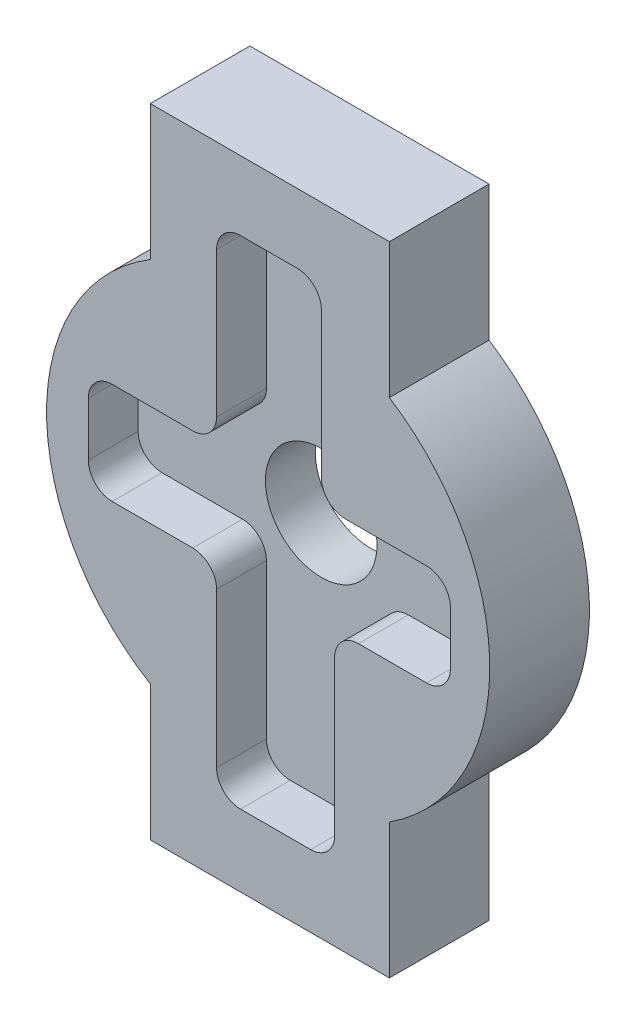
ISO-10303-21;
HEADER;
FILE_DESCRIPTION(('STEP AP214'),'2;1');
FILE_NAME('part.step','',(''),(''),'','','');
FILE_SCHEMA(('AUTOMOTIVE_DESIGN { 1 0 10303 214 1 1 1 1 }'));
ENDSEC;
DATA;
#1=APPLICATION_CONTEXT('core data for automotive mechanical design processes');
#2=APPLICATION_PROTOCOL_DEFINITION('international standard','automotive_design',2000,#1);
#3=PRODUCT_CONTEXT('',#1,'mechanical');
#4=PRODUCT('Part','Part','',(#3));
#5=PRODUCT_RELATED_PRODUCT_CATEGORY('part','',(#4));
#6=PRODUCT_DEFINITION_FORMATION('','',#4);
#7=PRODUCT_DEFINITION_CONTEXT('part definition',#1,'design');
#8=PRODUCT_DEFINITION('design','',#6,#7);
#9=PRODUCT_DEFINITION_SHAPE('','',#8);
#10=(LENGTH_UNIT() NAMED_UNIT(*) SI_UNIT(.MILLI.,.METRE.));
#11=(NAMED_UNIT(*) PLANE_ANGLE_UNIT() SI_UNIT($,.RADIAN.));
#12=(NAMED_UNIT(*) SI_UNIT($,.STERADIAN.) SOLID_ANGLE_UNIT());
#13=UNCERTAINTY_MEASURE_WITH_UNIT(LENGTH_MEASURE(1.E-05),#10,'distance_accuracy_value','');
#14=(GEOMETRIC_REPRESENTATION_CONTEXT(3) GLOBAL_UNCERTAINTY_ASSIGNED_CONTEXT((#13)) GLOBAL_UNIT_ASSIGNED_CONTEXT((#10,
#11,#12)) REPRESENTATION_CONTEXT('',''));
#15=CARTESIAN_POINT('',(0.,0.,0.));
#16=DIRECTION('',(0.,0.,1.));
#17=DIRECTION('',(1.,0.,0.));
#18=AXIS2_PLACEMENT_3D('',#15,#16,#17);
#19=CARTESIAN_POINT('',(-247.431655244566,224.,15.));
#20=DIRECTION('',(0.,0.,1.));
#21=DIRECTION('',(1.,0.,0.));
#22=AXIS2_PLACEMENT_3D('',#19,#20,#21);
#23=PLANE('',#22);
#24=DIRECTION('',(0.,-1.,0.));
#25=VECTOR('',#24,1.);
#26=CARTESIAN_POINT('',(-249.671710999745,211.604094919076,15.));
#27=LINE('',#26,#25);
#28=CARTESIAN_POINT('',(-249.671710999745,220.552559627215,15.));
#29=VERTEX_POINT('',#28);
#30=CARTESIAN_POINT('',(-249.671710999745,212.804094919076,15.));
#31=VERTEX_POINT('',#30);
#32=EDGE_CURVE('E523',#29,#31,#27,.T.);
#33=ORIENTED_EDGE('',*,*,#32,.F.);
#34=CARTESIAN_POINT('',(-250.871710999745,220.552559627215,15.));
#35=DIRECTION('',(0.,0.,1.));
#36=DIRECTION('',(1.,0.,0.));
#37=AXIS2_PLACEMENT_3D('',#34,#35,#36);
#38=CIRCLE('',#37,1.2);
#39=CARTESIAN_POINT('',(-250.871710999745,221.752559627215,15.));
#40=VERTEX_POINT('',#39);
#41=EDGE_CURVE('E349',#29,#40,#38,.T.);
#42=ORIENTED_EDGE('',*,*,#41,.T.);
#43=DIRECTION('',(1.,0.,0.));
#44=VECTOR('',#43,1.);
#45=CARTESIAN_POINT('',(-249.671710999745,221.752559627215,15.));
#46=LINE('',#45,#44);
#47=CARTESIAN_POINT('',(-254.908895334077,221.752559627215,15.));
#48=VERTEX_POINT('',#47);
#49=EDGE_CURVE('E519',#48,#40,#46,.T.);
#50=ORIENTED_EDGE('',*,*,#49,.F.);
#51=CARTESIAN_POINT('',(-254.908895334077,222.952559627215,15.));
#52=DIRECTION('',(0.,0.,1.));
#53=DIRECTION('',(1.,0.,0.));
#54=AXIS2_PLACEMENT_3D('',#51,#52,#53);
#55=CIRCLE('',#54,1.2);
#56=CARTESIAN_POINT('',(-256.108895334077,222.952559627215,15.));
#57=VERTEX_POINT('',#56);
#58=EDGE_CURVE('E410',#48,#57,#55,.F.);
#59=ORIENTED_EDGE('',*,*,#58,.T.);
#60=DIRECTION('',(0.,-1.,0.));
#61=VECTOR('',#60,1.);
#62=CARTESIAN_POINT('',(-256.108895334077,221.752559627215,15.));
#63=LINE('',#62,#61);
#64=CARTESIAN_POINT('',(-256.108895334077,225.643297037313,15.));
#65=VERTEX_POINT('',#64);
#66=EDGE_CURVE('E515',#65,#57,#63,.T.);
#67=ORIENTED_EDGE('',*,*,#66,.F.);
#68=CARTESIAN_POINT('',(-254.908895334077,225.643297037313,15.));
#69=DIRECTION('',(0.,0.,1.));
#70=DIRECTION('',(1.,0.,0.));
#71=AXIS2_PLACEMENT_3D('',#68,#69,#70);
#72=CIRCLE('',#71,1.2);
#73=CARTESIAN_POINT('',(-254.908895334077,226.843297037313,15.));
#74=VERTEX_POINT('',#73);
#75=EDGE_CURVE('E407',#65,#74,#72,.F.);
#76=ORIENTED_EDGE('',*,*,#75,.T.);
#77=DIRECTION('',(-1.,0.,0.));
#78=VECTOR('',#77,1.);
#79=CARTESIAN_POINT('',(-256.108895334077,226.843297037313,15.));
#80=LINE('',#79,#78);
#81=CARTESIAN_POINT('',(-250.871710999745,226.843297037313,15.));
#82=VERTEX_POINT('',#81);
#83=EDGE_CURVE('E511',#82,#74,#80,.T.);
#84=ORIENTED_EDGE('',*,*,#83,.F.);
#85=CARTESIAN_POINT('',(-250.871710999745,228.043297037313,15.));
#86=DIRECTION('',(0.,0.,1.));
#87=DIRECTION('',(1.,0.,0.));
#88=AXIS2_PLACEMENT_3D('',#85,#86,#87);
#89=CIRCLE('',#88,1.2);
#90=CARTESIAN_POINT('',(-249.671710999745,228.043297037313,15.));
#91=VERTEX_POINT('',#90);
#92=EDGE_CURVE('E340',#82,#91,#89,.T.);
#93=ORIENTED_EDGE('',*,*,#92,.T.);
#94=DIRECTION('',(0.,-1.,0.));
#95=VECTOR('',#94,1.);
#96=CARTESIAN_POINT('',(-249.671710999745,226.843297037313,15.));
#97=LINE('',#96,#95);
#98=CARTESIAN_POINT('',(-249.671710999745,235.326764936957,15.));
#99=VERTEX_POINT('',#98);
#100=EDGE_CURVE('E441',#99,#91,#97,.T.);
#101=ORIENTED_EDGE('',*,*,#100,.F.);
#102=CARTESIAN_POINT('',(-248.471710999745,235.326764936957,15.));
#103=DIRECTION('',(0.,0.,1.));
#104=DIRECTION('',(1.,0.,0.));
#105=AXIS2_PLACEMENT_3D('',#102,#103,#104);
#106=CIRCLE('',#105,1.2);
#107=CARTESIAN_POINT('',(-248.471710999745,236.526764936957,15.));
#108=VERTEX_POINT('',#107);
#109=EDGE_CURVE('E47',#99,#108,#106,.F.);
#110=ORIENTED_EDGE('',*,*,#109,.T.);
#111=DIRECTION('',(-1.,0.,0.));
#112=VECTOR('',#111,1.);
#113=CARTESIAN_POINT('',(-249.671710999745,236.526764936957,15.));
#114=LINE('',#113,#112);
#115=CARTESIAN_POINT('',(-245.614971282796,236.526764936957,15.));
#116=VERTEX_POINT('',#115);
#117=EDGE_CURVE('E439',#116,#108,#114,.T.);
#118=ORIENTED_EDGE('',*,*,#117,.F.);
#119=CARTESIAN_POINT('',(-245.614971282796,235.326764936957,15.));
#120=DIRECTION('',(0.,0.,1.));
#121=DIRECTION('',(1.,0.,0.));
#122=AXIS2_PLACEMENT_3D('',#119,#120,#121);
#123=CIRCLE('',#122,1.2);
#124=CARTESIAN_POINT('',(-244.414971282796,235.326764936957,15.));
#125=VERTEX_POINT('',#124);
#126=EDGE_CURVE('E11',#116,#125,#123,.F.);
#127=ORIENTED_EDGE('',*,*,#126,.T.);
#128=DIRECTION('',(0.,1.,0.));
#129=VECTOR('',#128,1.);
#130=CARTESIAN_POINT('',(-244.414971282796,236.526764936957,15.));
#131=LINE('',#130,#129);
#132=CARTESIAN_POINT('',(-244.414971282796,228.043297037313,15.));
#133=VERTEX_POINT('',#132);
#134=EDGE_CURVE('E452',#133,#125,#131,.T.);
#135=ORIENTED_EDGE('',*,*,#134,.F.);
#136=CARTESIAN_POINT('',(-243.214971282796,228.043297037313,15.));
#137=DIRECTION('',(0.,0.,1.));
#138=DIRECTION('',(1.,0.,0.));
#139=AXIS2_PLACEMENT_3D('',#136,#137,#138);
#140=CIRCLE('',#139,1.2);
#141=CARTESIAN_POINT('',(-243.214971282796,226.843297037313,15.));
#142=VERTEX_POINT('',#141);
#143=EDGE_CURVE('E343',#133,#142,#140,.T.);
#144=ORIENTED_EDGE('',*,*,#143,.T.);
#145=DIRECTION('',(-1.,0.,0.));
#146=VECTOR('',#145,1.);
#147=CARTESIAN_POINT('',(-244.414971282796,226.843297037313,15.));
#148=LINE('',#147,#146);
#149=CARTESIAN_POINT('',(-239.140881315605,226.843297037313,15.));
#150=VERTEX_POINT('',#149);
#151=EDGE_CURVE('E542',#150,#142,#148,.T.);
#152=ORIENTED_EDGE('',*,*,#151,.F.);
#153=CARTESIAN_POINT('',(-239.140881315605,225.643297037313,15.));
#154=DIRECTION('',(0.,0.,1.));
#155=DIRECTION('',(1.,0.,0.));
#156=AXIS2_PLACEMENT_3D('',#153,#154,#155);
#157=CIRCLE('',#156,1.2);
#158=CARTESIAN_POINT('',(-237.940881315605,225.643297037313,15.));
#159=VERTEX_POINT('',#158);
#160=EDGE_CURVE('E426',#150,#159,#157,.F.);
#161=ORIENTED_EDGE('',*,*,#160,.T.);
#162=DIRECTION('',(0.,1.,0.));
#163=VECTOR('',#162,1.);
#164=CARTESIAN_POINT('',(-237.940881315605,226.843297037313,15.));
#165=LINE('',#164,#163);
#166=CARTESIAN_POINT('',(-237.940881315605,222.952559627215,15.));
#167=VERTEX_POINT('',#166);
#168=EDGE_CURVE('E538',#167,#159,#165,.T.);
#169=ORIENTED_EDGE('',*,*,#168,.F.);
#170=CARTESIAN_POINT('',(-239.140881315605,222.952559627215,15.));
#171=DIRECTION('',(0.,0.,1.));
#172=DIRECTION('',(1.,0.,0.));
#173=AXIS2_PLACEMENT_3D('',#170,#171,#172);
#174=CIRCLE('',#173,1.2);
#175=CARTESIAN_POINT('',(-239.140881315605,221.752559627215,15.));
#176=VERTEX_POINT('',#175);
#177=EDGE_CURVE('E423',#167,#176,#174,.F.);
#178=ORIENTED_EDGE('',*,*,#177,.T.);
#179=DIRECTION('',(1.,0.,0.));
#180=VECTOR('',#179,1.);
#181=CARTESIAN_POINT('',(-237.940881315605,221.752559627215,15.));
#182=LINE('',#181,#180);
#183=CARTESIAN_POINT('',(-242.550962055392,221.752559627215,15.));
#184=VERTEX_POINT('',#183);
#185=EDGE_CURVE('E534',#184,#176,#182,.T.);
#186=ORIENTED_EDGE('',*,*,#185,.F.);
#187=CARTESIAN_POINT('',(-242.550962055392,220.552559627215,15.));
#188=DIRECTION('',(0.,0.,1.));
#189=DIRECTION('',(1.,0.,0.));
#190=AXIS2_PLACEMENT_3D('',#187,#188,#189);
#191=CIRCLE('',#190,1.2);
#192=CARTESIAN_POINT('',(-243.750962055392,220.552559627215,15.));
#193=VERTEX_POINT('',#192);
#194=EDGE_CURVE('E346',#184,#193,#191,.T.);
#195=ORIENTED_EDGE('',*,*,#194,.T.);
#196=DIRECTION('',(0.,1.,0.));
#197=VECTOR('',#196,1.);
#198=CARTESIAN_POINT('',(-243.750962055392,221.752559627215,15.));
#199=LINE('',#198,#197);
#200=CARTESIAN_POINT('',(-243.750962055392,212.804094919076,15.));
#201=VERTEX_POINT('',#200);
#202=EDGE_CURVE('E530',#201,#193,#199,.T.);
#203=ORIENTED_EDGE('',*,*,#202,.F.);
#204=CARTESIAN_POINT('',(-244.950962055392,212.804094919076,15.));
#205=DIRECTION('',(0.,0.,1.));
#206=DIRECTION('',(1.,0.,0.));
#207=AXIS2_PLACEMENT_3D('',#204,#205,#206);
#208=CIRCLE('',#207,1.2);
#209=CARTESIAN_POINT('',(-244.950962055392,211.604094919076,15.));
#210=VERTEX_POINT('',#209);
#211=EDGE_CURVE('E54',#201,#210,#208,.F.);
#212=ORIENTED_EDGE('',*,*,#211,.T.);
#213=DIRECTION('',(1.,0.,0.));
#214=VECTOR('',#213,1.);
#215=CARTESIAN_POINT('',(-243.750962055392,211.604094919076,15.));
#216=LINE('',#215,#214);
#217=CARTESIAN_POINT('',(-248.471710999745,211.604094919076,15.));
#218=VERTEX_POINT('',#217);
#219=EDGE_CURVE('E527',#218,#210,#216,.T.);
#220=ORIENTED_EDGE('',*,*,#219,.F.);
#221=CARTESIAN_POINT('',(-248.471710999745,212.804094919076,15.));
#222=DIRECTION('',(0.,0.,1.));
#223=DIRECTION('',(1.,0.,0.));
#224=AXIS2_PLACEMENT_3D('',#221,#222,#223);
#225=CIRCLE('',#224,1.2);
#226=EDGE_CURVE('E62',#218,#31,#225,.F.);
#227=ORIENTED_EDGE('',*,*,#226,.T.);
#228=EDGE_LOOP('',(#33,#42,#50,#59,#67,#76,#84,#93,#101,#110,#118,#127,#135,#144,#152,#161,#169,
#178,#186,#195,#203,#212,#220,#227));
#229=FACE_BOUND('',#228,.T.);
#230=DIRECTION('',(0.,-1.,0.));
#231=VECTOR('',#230,1.);
#232=CARTESIAN_POINT('',(-253.,240.,15.));
#233=LINE('',#232,#231);
#234=CARTESIAN_POINT('',(-253.,240.,15.));
#235=VERTEX_POINT('',#234);
#236=CARTESIAN_POINT('',(-253.,233.219543457031,15.));
#237=VERTEX_POINT('',#236);
#238=EDGE_CURVE('E261',#235,#237,#233,.T.);
#239=ORIENTED_EDGE('',*,*,#238,.T.);
#240=CARTESIAN_POINT('',(-247.431655244566,224.,15.));
#241=DIRECTION('',(0.,0.,1.));
#242=DIRECTION('',(1.,0.,0.));
#243=AXIS2_PLACEMENT_3D('',#240,#241,#242);
#244=CIRCLE('',#243,10.7706288057596);
#245=CARTESIAN_POINT('',(-253.,214.780456542969,15.));
#246=VERTEX_POINT('',#245);
#247=EDGE_CURVE('E249',#237,#246,#244,.T.);
#248=ORIENTED_EDGE('',*,*,#247,.T.);
#249=DIRECTION('',(0.,-1.,0.));
#250=VECTOR('',#249,1.);
#251=CARTESIAN_POINT('',(-253.,208.,15.));
#252=LINE('',#251,#250);
#253=CARTESIAN_POINT('',(-253.,208.,15.));
#254=VERTEX_POINT('',#253);
#255=EDGE_CURVE('E260',#246,#254,#252,.T.);
#256=ORIENTED_EDGE('',*,*,#255,.T.);
#257=DIRECTION('',(1.,0.,0.));
#258=VECTOR('',#257,1.);
#259=CARTESIAN_POINT('',(-241.,208.,15.));
#260=LINE('',#259,#258);
#261=CARTESIAN_POINT('',(-241.,208.,15.));
#262=VERTEX_POINT('',#261);
#263=EDGE_CURVE('E554',#254,#262,#260,.T.);
#264=ORIENTED_EDGE('',*,*,#263,.T.);
#265=DIRECTION('',(0.,1.,0.));
#266=VECTOR('',#265,1.);
#267=CARTESIAN_POINT('',(-241.,214.780456542969,15.));
#268=LINE('',#267,#266);
#269=CARTESIAN_POINT('',(-241.,214.780456542969,15.));
#270=VERTEX_POINT('',#269);
#271=EDGE_CURVE('E557',#262,#270,#268,.T.);
#272=ORIENTED_EDGE('',*,*,#271,.T.);
#273=CARTESIAN_POINT('',(-246.92263510051,224.,15.));
#274=DIRECTION('',(0.,0.,1.));
#275=DIRECTION('',(-1.,0.,0.));
#276=AXIS2_PLACEMENT_3D('',#273,#274,#275);
#277=CIRCLE('',#276,10.9579919734355);
#278=CARTESIAN_POINT('',(-241.,233.219543457031,15.));
#279=VERTEX_POINT('',#278);
#280=EDGE_CURVE('E560',#270,#279,#277,.T.);
#281=ORIENTED_EDGE('',*,*,#280,.T.);
#282=DIRECTION('',(0.,1.,0.));
#283=VECTOR('',#282,1.);
#284=CARTESIAN_POINT('',(-241.,240.,15.));
#285=LINE('',#284,#283);
#286=CARTESIAN_POINT('',(-241.,240.,15.));
#287=VERTEX_POINT('',#286);
#288=EDGE_CURVE('E563',#279,#287,#285,.T.);
#289=ORIENTED_EDGE('',*,*,#288,.T.);
#290=DIRECTION('',(-1.,0.,0.));
#291=VECTOR('',#290,1.);
#292=CARTESIAN_POINT('',(-253.,240.,15.));
#293=LINE('',#292,#291);
#294=EDGE_CURVE('E265',#287,#235,#293,.T.);
#295=ORIENTED_EDGE('',*,*,#294,.T.);
#296=EDGE_LOOP('',(#239,#248,#256,#264,#272,#281,#289,#295));
#297=FACE_BOUND('',#296,.T.);
#298=ADVANCED_FACE('F38',(#229,#297),#23,.T.);
#299=CARTESIAN_POINT('',(-247.431655244566,224.,10.));
#300=DIRECTION('',(0.,0.,1.));
#301=DIRECTION('',(1.,0.,0.));
#302=AXIS2_PLACEMENT_3D('',#299,#300,#301);
#303=PLANE('',#302);
#304=DIRECTION('',(0.,-1.,0.));
#305=VECTOR('',#304,1.);
#306=CARTESIAN_POINT('',(-253.,240.,10.));
#307=LINE('',#306,#305);
#308=CARTESIAN_POINT('',(-253.,240.,10.));
#309=VERTEX_POINT('',#308);
#310=CARTESIAN_POINT('',(-253.,233.219543457031,10.));
#311=VERTEX_POINT('',#310);
#312=EDGE_CURVE('E274',#309,#311,#307,.T.);
#313=ORIENTED_EDGE('',*,*,#312,.F.);
#314=DIRECTION('',(-1.,0.,0.));
#315=VECTOR('',#314,1.);
#316=CARTESIAN_POINT('',(-253.,240.,10.));
#317=LINE('',#316,#315);
#318=CARTESIAN_POINT('',(-241.,240.,10.));
#319=VERTEX_POINT('',#318);
#320=EDGE_CURVE('E270',#319,#309,#317,.T.);
#321=ORIENTED_EDGE('',*,*,#320,.F.);
#322=DIRECTION('',(0.,1.,0.));
#323=VECTOR('',#322,1.);
#324=CARTESIAN_POINT('',(-241.,240.,10.));
#325=LINE('',#324,#323);
#326=CARTESIAN_POINT('',(-241.,233.219543457031,10.));
#327=VERTEX_POINT('',#326);
#328=EDGE_CURVE('E586',#327,#319,#325,.T.);
#329=ORIENTED_EDGE('',*,*,#328,.F.);
#330=CARTESIAN_POINT('',(-246.92263510051,224.,10.));
#331=DIRECTION('',(0.,0.,1.));
#332=DIRECTION('',(-1.,0.,0.));
#333=AXIS2_PLACEMENT_3D('',#330,#331,#332);
#334=CIRCLE('',#333,10.9579919734355);
#335=CARTESIAN_POINT('',(-241.,214.780456542969,10.));
#336=VERTEX_POINT('',#335);
#337=EDGE_CURVE('E583',#336,#327,#334,.T.);
#338=ORIENTED_EDGE('',*,*,#337,.F.);
#339=DIRECTION('',(0.,1.,0.));
#340=VECTOR('',#339,1.);
#341=CARTESIAN_POINT('',(-241.,214.780456542969,10.));
#342=LINE('',#341,#340);
#343=CARTESIAN_POINT('',(-241.,208.,10.));
#344=VERTEX_POINT('',#343);
#345=EDGE_CURVE('E580',#344,#336,#342,.T.);
#346=ORIENTED_EDGE('',*,*,#345,.F.);
#347=DIRECTION('',(1.,0.,0.));
#348=VECTOR('',#347,1.);
#349=CARTESIAN_POINT('',(-241.,208.,10.));
#350=LINE('',#349,#348);
#351=CARTESIAN_POINT('',(-253.,208.,10.));
#352=VERTEX_POINT('',#351);
#353=EDGE_CURVE('E577',#352,#344,#350,.T.);
#354=ORIENTED_EDGE('',*,*,#353,.F.);
#355=DIRECTION('',(0.,-1.,0.));
#356=VECTOR('',#355,1.);
#357=CARTESIAN_POINT('',(-253.,208.,10.));
#358=LINE('',#357,#356);
#359=CARTESIAN_POINT('',(-253.,214.780456542969,10.));
#360=VERTEX_POINT('',#359);
#361=EDGE_CURVE('E574',#360,#352,#358,.T.);
#362=ORIENTED_EDGE('',*,*,#361,.F.);
#363=CARTESIAN_POINT('',(-247.431655244566,224.,10.));
#364=DIRECTION('',(0.,0.,1.));
#365=DIRECTION('',(1.,0.,0.));
#366=AXIS2_PLACEMENT_3D('',#363,#364,#365);
#367=CIRCLE('',#366,10.7706288057596);
#368=EDGE_CURVE('E571',#311,#360,#367,.T.);
#369=ORIENTED_EDGE('',*,*,#368,.F.);
#370=EDGE_LOOP('',(#313,#321,#329,#338,#346,#354,#362,#369));
#371=FACE_BOUND('',#370,.T.);
#372=CARTESIAN_POINT('',(-246.92263510051,224.,10.));
#373=DIRECTION('',(0.,0.,1.));
#374=DIRECTION('',(1.,0.,0.));
#375=AXIS2_PLACEMENT_3D('',#372,#373,#374);
#376=CIRCLE('',#375,2.8);
#377=CARTESIAN_POINT('',(-244.12263510051,224.,10.));
#378=VERTEX_POINT('',#377);
#379=EDGE_CURVE('E289',#378,#378,#376,.T.);
#380=ORIENTED_EDGE('',*,*,#379,.T.);
#381=EDGE_LOOP('',(#380));
#382=FACE_BOUND('',#381,.T.);
#383=ADVANCED_FACE('F620',(#371,#382),#303,.F.);
#384=CARTESIAN_POINT('',(-253.,240.,15.));
#385=DIRECTION('',(1.,0.,0.));
#386=DIRECTION('',(0.,0.,-1.));
#387=AXIS2_PLACEMENT_3D('',#384,#385,#386);
#388=PLANE('',#387);
#389=ORIENTED_EDGE('',*,*,#312,.T.);
#390=DIRECTION('',(0.,0.,-1.));
#391=VECTOR('',#390,1.);
#392=CARTESIAN_POINT('',(-253.,233.219543457031,15.));
#393=LINE('',#392,#391);
#394=EDGE_CURVE('E253',#237,#311,#393,.T.);
#395=ORIENTED_EDGE('',*,*,#394,.F.);
#396=ORIENTED_EDGE('',*,*,#238,.F.);
#397=DIRECTION('',(0.,0.,-1.));
#398=VECTOR('',#397,1.);
#399=CARTESIAN_POINT('',(-253.,240.,15.));
#400=LINE('',#399,#398);
#401=EDGE_CURVE('E568',#235,#309,#400,.T.);
#402=ORIENTED_EDGE('',*,*,#401,.T.);
#403=EDGE_LOOP('',(#389,#395,#396,#402));
#404=FACE_BOUND('',#403,.T.);
#405=ADVANCED_FACE('F272',(#404),#388,.F.);
#406=CARTESIAN_POINT('',(-247.431655244566,224.,15.));
#407=DIRECTION('',(0.,0.,-1.));
#408=DIRECTION('',(-1.,0.,0.));
#409=AXIS2_PLACEMENT_3D('',#406,#407,#408);
#410=CYLINDRICAL_SURFACE('',#409,10.7706288057596);
#411=ORIENTED_EDGE('',*,*,#368,.T.);
#412=DIRECTION('',(0.,0.,-1.));
#413=VECTOR('',#412,1.);
#414=CARTESIAN_POINT('',(-253.,214.780456542969,15.));
#415=LINE('',#414,#413);
#416=EDGE_CURVE('E256',#246,#360,#415,.T.);
#417=ORIENTED_EDGE('',*,*,#416,.F.);
#418=ORIENTED_EDGE('',*,*,#247,.F.);
#419=ORIENTED_EDGE('',*,*,#394,.T.);
#420=EDGE_LOOP('',(#411,#417,#418,#419));
#421=FACE_BOUND('',#420,.T.);
#422=ADVANCED_FACE('F251',(#421),#410,.T.);
#423=CARTESIAN_POINT('',(-253.,208.,15.));
#424=DIRECTION('',(1.,0.,0.));
#425=DIRECTION('',(0.,0.,-1.));
#426=AXIS2_PLACEMENT_3D('',#423,#424,#425);
#427=PLANE('',#426);
#428=ORIENTED_EDGE('',*,*,#361,.T.);
#429=DIRECTION('',(0.,0.,-1.));
#430=VECTOR('',#429,1.);
#431=CARTESIAN_POINT('',(-253.,208.,15.));
#432=LINE('',#431,#430);
#433=EDGE_CURVE('E282',#254,#352,#432,.T.);
#434=ORIENTED_EDGE('',*,*,#433,.F.);
#435=ORIENTED_EDGE('',*,*,#255,.F.);
#436=ORIENTED_EDGE('',*,*,#416,.T.);
#437=EDGE_LOOP('',(#428,#434,#435,#436));
#438=FACE_BOUND('',#437,.T.);
#439=ADVANCED_FACE('F634',(#438),#427,.F.);
#440=CARTESIAN_POINT('',(-241.,208.,15.));
#441=DIRECTION('',(0.,1.,0.));
#442=DIRECTION('',(0.,0.,1.));
#443=AXIS2_PLACEMENT_3D('',#440,#441,#442);
#444=PLANE('',#443);
#445=ORIENTED_EDGE('',*,*,#353,.T.);
#446=DIRECTION('',(0.,0.,-1.));
#447=VECTOR('',#446,1.);
#448=CARTESIAN_POINT('',(-241.,208.,15.));
#449=LINE('',#448,#447);
#450=EDGE_CURVE('E605',#262,#344,#449,.T.);
#451=ORIENTED_EDGE('',*,*,#450,.F.);
#452=ORIENTED_EDGE('',*,*,#263,.F.);
#453=ORIENTED_EDGE('',*,*,#433,.T.);
#454=EDGE_LOOP('',(#445,#451,#452,#453));
#455=FACE_BOUND('',#454,.T.);
#456=ADVANCED_FACE('F614',(#455),#444,.F.);
#457=CARTESIAN_POINT('',(-241.,214.780456542969,15.));
#458=DIRECTION('',(-1.,0.,0.));
#459=DIRECTION('',(0.,0.,1.));
#460=AXIS2_PLACEMENT_3D('',#457,#458,#459);
#461=PLANE('',#460);
#462=ORIENTED_EDGE('',*,*,#345,.T.);
#463=DIRECTION('',(0.,0.,-1.));
#464=VECTOR('',#463,1.);
#465=CARTESIAN_POINT('',(-241.,214.780456542969,15.));
#466=LINE('',#465,#464);
#467=EDGE_CURVE('E601',#270,#336,#466,.T.);
#468=ORIENTED_EDGE('',*,*,#467,.F.);
#469=ORIENTED_EDGE('',*,*,#271,.F.);
#470=ORIENTED_EDGE('',*,*,#450,.T.);
#471=EDGE_LOOP('',(#462,#468,#469,#470));
#472=FACE_BOUND('',#471,.T.);
#473=ADVANCED_FACE('F626',(#472),#461,.F.);
#474=CARTESIAN_POINT('',(-246.92263510051,224.,15.));
#475=DIRECTION('',(0.,0.,-1.));
#476=DIRECTION('',(-1.,0.,0.));
#477=AXIS2_PLACEMENT_3D('',#474,#475,#476);
#478=CYLINDRICAL_SURFACE('',#477,10.9579919734355);
#479=ORIENTED_EDGE('',*,*,#337,.T.);
#480=DIRECTION('',(0.,0.,-1.));
#481=VECTOR('',#480,1.);
#482=CARTESIAN_POINT('',(-241.,233.219543457031,15.));
#483=LINE('',#482,#481);
#484=EDGE_CURVE('E597',#279,#327,#483,.T.);
#485=ORIENTED_EDGE('',*,*,#484,.F.);
#486=ORIENTED_EDGE('',*,*,#280,.F.);
#487=ORIENTED_EDGE('',*,*,#467,.T.);
#488=EDGE_LOOP('',(#479,#485,#486,#487));
#489=FACE_BOUND('',#488,.T.);
#490=ADVANCED_FACE('F630',(#489),#478,.T.);
#491=CARTESIAN_POINT('',(-241.,240.,15.));
#492=DIRECTION('',(-1.,0.,0.));
#493=DIRECTION('',(0.,0.,1.));
#494=AXIS2_PLACEMENT_3D('',#491,#492,#493);
#495=PLANE('',#494);
#496=ORIENTED_EDGE('',*,*,#328,.T.);
#497=DIRECTION('',(0.,0.,-1.));
#498=VECTOR('',#497,1.);
#499=CARTESIAN_POINT('',(-241.,240.,15.));
#500=LINE('',#499,#498);
#501=EDGE_CURVE('E593',#287,#319,#500,.T.);
#502=ORIENTED_EDGE('',*,*,#501,.F.);
#503=ORIENTED_EDGE('',*,*,#288,.F.);
#504=ORIENTED_EDGE('',*,*,#484,.T.);
#505=EDGE_LOOP('',(#496,#502,#503,#504));
#506=FACE_BOUND('',#505,.T.);
#507=ADVANCED_FACE('F658',(#506),#495,.F.);
#508=CARTESIAN_POINT('',(-253.,240.,15.));
#509=DIRECTION('',(0.,-1.,0.));
#510=DIRECTION('',(0.,0.,-1.));
#511=AXIS2_PLACEMENT_3D('',#508,#509,#510);
#512=PLANE('',#511);
#513=ORIENTED_EDGE('',*,*,#320,.T.);
#514=ORIENTED_EDGE('',*,*,#401,.F.);
#515=ORIENTED_EDGE('',*,*,#294,.F.);
#516=ORIENTED_EDGE('',*,*,#501,.T.);
#517=EDGE_LOOP('',(#513,#514,#515,#516));
#518=FACE_BOUND('',#517,.T.);
#519=ADVANCED_FACE('F655',(#518),#512,.F.);
#520=CARTESIAN_POINT('',(-246.92263510051,224.,15.));
#521=DIRECTION('',(0.,0.,-1.));
#522=DIRECTION('',(-1.,0.,0.));
#523=AXIS2_PLACEMENT_3D('',#520,#521,#522);
#524=CYLINDRICAL_SURFACE('',#523,2.8);
#525=CARTESIAN_POINT('',(-246.92263510051,224.,12.5));
#526=DIRECTION('',(0.,0.,-1.));
#527=DIRECTION('',(-1.,0.,0.));
#528=AXIS2_PLACEMENT_3D('',#525,#526,#527);
#529=CIRCLE('',#528,2.8);
#530=CARTESIAN_POINT('',(-249.72263510051,224.,12.5));
#531=VERTEX_POINT('',#530);
#532=EDGE_CURVE('E286',#531,#531,#529,.T.);
#533=ORIENTED_EDGE('',*,*,#532,.F.);
#534=EDGE_LOOP('',(#533));
#535=FACE_BOUND('',#534,.T.);
#536=ORIENTED_EDGE('',*,*,#379,.F.);
#537=EDGE_LOOP('',(#536));
#538=FACE_BOUND('',#537,.T.);
#539=ADVANCED_FACE('F652',(#535,#538),#524,.F.);
#540=CARTESIAN_POINT('',(-249.671710999745,226.843297037313,12.5));
#541=DIRECTION('',(-1.,0.,0.));
#542=DIRECTION('',(0.,0.,1.));
#543=AXIS2_PLACEMENT_3D('',#540,#541,#542);
#544=PLANE('',#543);
#545=ORIENTED_EDGE('',*,*,#100,.T.);
#546=DIRECTION('',(0.,0.,1.));
#547=VECTOR('',#546,1.);
#548=CARTESIAN_POINT('',(-249.671710999745,228.043297037313,12.5));
#549=LINE('',#548,#547);
#550=CARTESIAN_POINT('',(-249.671710999745,228.043297037313,12.5));
#551=VERTEX_POINT('',#550);
#552=EDGE_CURVE('E397',#91,#551,#549,.F.);
#553=ORIENTED_EDGE('',*,*,#552,.T.);
#554=DIRECTION('',(0.,-1.,0.));
#555=VECTOR('',#554,1.);
#556=CARTESIAN_POINT('',(-249.671710999745,226.843297037313,12.5));
#557=LINE('',#556,#555);
#558=CARTESIAN_POINT('',(-249.671710999745,235.326764936957,12.5));
#559=VERTEX_POINT('',#558);
#560=EDGE_CURVE('E451',#559,#551,#557,.T.);
#561=ORIENTED_EDGE('',*,*,#560,.F.);
#562=DIRECTION('',(0.,0.,1.));
#563=VECTOR('',#562,1.);
#564=CARTESIAN_POINT('',(-249.671710999745,235.326764936957,15.));
#565=LINE('',#564,#563);
#566=EDGE_CURVE('E393',#559,#99,#565,.T.);
#567=ORIENTED_EDGE('',*,*,#566,.T.);
#568=EDGE_LOOP('',(#545,#553,#561,#567));
#569=FACE_BOUND('',#568,.T.);
#570=ADVANCED_FACE('F463',(#569),#544,.F.);
#571=CARTESIAN_POINT('',(-249.671710999745,236.526764936957,12.5));
#572=DIRECTION('',(0.,1.,0.));
#573=DIRECTION('',(0.,0.,1.));
#574=AXIS2_PLACEMENT_3D('',#571,#572,#573);
#575=PLANE('',#574);
#576=ORIENTED_EDGE('',*,*,#117,.T.);
#577=DIRECTION('',(0.,0.,1.));
#578=VECTOR('',#577,1.);
#579=CARTESIAN_POINT('',(-248.471710999745,236.526764936957,12.5));
#580=LINE('',#579,#578);
#581=CARTESIAN_POINT('',(-248.471710999745,236.526764936957,12.5));
#582=VERTEX_POINT('',#581);
#583=EDGE_CURVE('E404',#108,#582,#580,.F.);
#584=ORIENTED_EDGE('',*,*,#583,.T.);
#585=DIRECTION('',(-1.,0.,0.));
#586=VECTOR('',#585,1.);
#587=CARTESIAN_POINT('',(-249.671710999745,236.526764936957,12.5));
#588=LINE('',#587,#586);
#589=CARTESIAN_POINT('',(-245.614971282796,236.526764936957,12.5));
#590=VERTEX_POINT('',#589);
#591=EDGE_CURVE('E290',#590,#582,#588,.T.);
#592=ORIENTED_EDGE('',*,*,#591,.F.);
#593=DIRECTION('',(0.,0.,1.));
#594=VECTOR('',#593,1.);
#595=CARTESIAN_POINT('',(-245.614971282796,236.526764936957,15.));
#596=LINE('',#595,#594);
#597=EDGE_CURVE('E400',#590,#116,#596,.T.);
#598=ORIENTED_EDGE('',*,*,#597,.T.);
#599=EDGE_LOOP('',(#576,#584,#592,#598));
#600=FACE_BOUND('',#599,.T.);
#601=ADVANCED_FACE('F446',(#600),#575,.F.);
#602=CARTESIAN_POINT('',(-244.414971282796,236.526764936957,12.5));
#603=DIRECTION('',(1.,0.,0.));
#604=DIRECTION('',(0.,0.,-1.));
#605=AXIS2_PLACEMENT_3D('',#602,#603,#604);
#606=PLANE('',#605);
#607=DIRECTION('',(0.,1.,0.));
#608=VECTOR('',#607,1.);
#609=CARTESIAN_POINT('',(-244.414971282796,236.526764936957,12.5));
#610=LINE('',#609,#608);
#611=CARTESIAN_POINT('',(-244.414971282796,228.043297037313,12.5));
#612=VERTEX_POINT('',#611);
#613=CARTESIAN_POINT('',(-244.414971282796,235.326764936957,12.5));
#614=VERTEX_POINT('',#613);
#615=EDGE_CURVE('E503',#612,#614,#610,.T.);
#616=ORIENTED_EDGE('',*,*,#615,.F.);
#617=DIRECTION('',(0.,0.,1.));
#618=VECTOR('',#617,1.);
#619=CARTESIAN_POINT('',(-244.414971282796,228.043297037313,12.5));
#620=LINE('',#619,#618);
#621=EDGE_CURVE('E389',#612,#133,#620,.T.);
#622=ORIENTED_EDGE('',*,*,#621,.T.);
#623=ORIENTED_EDGE('',*,*,#134,.T.);
#624=DIRECTION('',(0.,0.,1.));
#625=VECTOR('',#624,1.);
#626=CARTESIAN_POINT('',(-244.414971282796,235.326764936957,12.5));
#627=LINE('',#626,#625);
#628=EDGE_CURVE('E386',#125,#614,#627,.F.);
#629=ORIENTED_EDGE('',*,*,#628,.T.);
#630=EDGE_LOOP('',(#616,#622,#623,#629));
#631=FACE_BOUND('',#630,.T.);
#632=ADVANCED_FACE('F699',(#631),#606,.F.);
#633=CARTESIAN_POINT('',(-244.414971282796,226.843297037313,12.5));
#634=DIRECTION('',(0.,1.,0.));
#635=DIRECTION('',(0.,0.,1.));
#636=AXIS2_PLACEMENT_3D('',#633,#634,#635);
#637=PLANE('',#636);
#638=DIRECTION('',(-1.,0.,0.));
#639=VECTOR('',#638,1.);
#640=CARTESIAN_POINT('',(-244.414971282796,226.843297037313,12.5));
#641=LINE('',#640,#639);
#642=CARTESIAN_POINT('',(-239.140881315605,226.843297037313,12.5));
#643=VERTEX_POINT('',#642);
#644=CARTESIAN_POINT('',(-243.214971282796,226.843297037313,12.5));
#645=VERTEX_POINT('',#644);
#646=EDGE_CURVE('E499',#643,#645,#641,.T.);
#647=ORIENTED_EDGE('',*,*,#646,.F.);
#648=DIRECTION('',(0.,0.,1.));
#649=VECTOR('',#648,1.);
#650=CARTESIAN_POINT('',(-239.140881315605,226.843297037313,15.));
#651=LINE('',#650,#649);
#652=EDGE_CURVE('E382',#643,#150,#651,.T.);
#653=ORIENTED_EDGE('',*,*,#652,.T.);
#654=ORIENTED_EDGE('',*,*,#151,.T.);
#655=DIRECTION('',(0.,0.,1.));
#656=VECTOR('',#655,1.);
#657=CARTESIAN_POINT('',(-243.214971282796,226.843297037313,12.5));
#658=LINE('',#657,#656);
#659=EDGE_CURVE('E379',#142,#645,#658,.F.);
#660=ORIENTED_EDGE('',*,*,#659,.T.);
#661=EDGE_LOOP('',(#647,#653,#654,#660));
#662=FACE_BOUND('',#661,.T.);
#663=ADVANCED_FACE('F706',(#662),#637,.F.);
#664=CARTESIAN_POINT('',(-237.940881315605,226.843297037313,12.5));
#665=DIRECTION('',(1.,0.,0.));
#666=DIRECTION('',(0.,0.,-1.));
#667=AXIS2_PLACEMENT_3D('',#664,#665,#666);
#668=PLANE('',#667);
#669=DIRECTION('',(0.,1.,0.));
#670=VECTOR('',#669,1.);
#671=CARTESIAN_POINT('',(-237.940881315605,226.843297037313,12.5));
#672=LINE('',#671,#670);
#673=CARTESIAN_POINT('',(-237.940881315605,222.952559627215,12.5));
#674=VERTEX_POINT('',#673);
#675=CARTESIAN_POINT('',(-237.940881315605,225.643297037313,12.5));
#676=VERTEX_POINT('',#675);
#677=EDGE_CURVE('E495',#674,#676,#672,.T.);
#678=ORIENTED_EDGE('',*,*,#677,.F.);
#679=DIRECTION('',(0.,0.,1.));
#680=VECTOR('',#679,1.);
#681=CARTESIAN_POINT('',(-237.940881315605,222.952559627215,15.));
#682=LINE('',#681,#680);
#683=EDGE_CURVE('E375',#674,#167,#682,.T.);
#684=ORIENTED_EDGE('',*,*,#683,.T.);
#685=ORIENTED_EDGE('',*,*,#168,.T.);
#686=DIRECTION('',(0.,0.,1.));
#687=VECTOR('',#686,1.);
#688=CARTESIAN_POINT('',(-237.940881315605,225.643297037313,12.5));
#689=LINE('',#688,#687);
#690=EDGE_CURVE('E372',#159,#676,#689,.F.);
#691=ORIENTED_EDGE('',*,*,#690,.T.);
#692=EDGE_LOOP('',(#678,#684,#685,#691));
#693=FACE_BOUND('',#692,.T.);
#694=ADVANCED_FACE('F714',(#693),#668,.F.);
#695=CARTESIAN_POINT('',(-237.940881315605,221.752559627215,12.5));
#696=DIRECTION('',(0.,-1.,0.));
#697=DIRECTION('',(0.,0.,-1.));
#698=AXIS2_PLACEMENT_3D('',#695,#696,#697);
#699=PLANE('',#698);
#700=DIRECTION('',(1.,0.,0.));
#701=VECTOR('',#700,1.);
#702=CARTESIAN_POINT('',(-237.940881315605,221.752559627215,12.5));
#703=LINE('',#702,#701);
#704=CARTESIAN_POINT('',(-242.550962055392,221.752559627215,12.5));
#705=VERTEX_POINT('',#704);
#706=CARTESIAN_POINT('',(-239.140881315605,221.752559627215,12.5));
#707=VERTEX_POINT('',#706);
#708=EDGE_CURVE('E491',#705,#707,#703,.T.);
#709=ORIENTED_EDGE('',*,*,#708,.F.);
#710=DIRECTION('',(0.,0.,1.));
#711=VECTOR('',#710,1.);
#712=CARTESIAN_POINT('',(-242.550962055392,221.752559627215,12.5));
#713=LINE('',#712,#711);
#714=EDGE_CURVE('E368',#705,#184,#713,.T.);
#715=ORIENTED_EDGE('',*,*,#714,.T.);
#716=ORIENTED_EDGE('',*,*,#185,.T.);
#717=DIRECTION('',(0.,0.,1.));
#718=VECTOR('',#717,1.);
#719=CARTESIAN_POINT('',(-239.140881315605,221.752559627215,12.5));
#720=LINE('',#719,#718);
#721=EDGE_CURVE('E365',#176,#707,#720,.F.);
#722=ORIENTED_EDGE('',*,*,#721,.T.);
#723=EDGE_LOOP('',(#709,#715,#716,#722));
#724=FACE_BOUND('',#723,.T.);
#725=ADVANCED_FACE('F722',(#724),#699,.F.);
#726=CARTESIAN_POINT('',(-243.750962055392,221.752559627215,12.5));
#727=DIRECTION('',(1.,0.,0.));
#728=DIRECTION('',(0.,0.,-1.));
#729=AXIS2_PLACEMENT_3D('',#726,#727,#728);
#730=PLANE('',#729);
#731=DIRECTION('',(0.,1.,0.));
#732=VECTOR('',#731,1.);
#733=CARTESIAN_POINT('',(-243.750962055392,221.752559627215,12.5));
#734=LINE('',#733,#732);
#735=CARTESIAN_POINT('',(-243.750962055392,212.804094919076,12.5));
#736=VERTEX_POINT('',#735);
#737=CARTESIAN_POINT('',(-243.750962055392,220.552559627215,12.5));
#738=VERTEX_POINT('',#737);
#739=EDGE_CURVE('E487',#736,#738,#734,.T.);
#740=ORIENTED_EDGE('',*,*,#739,.F.);
#741=DIRECTION('',(0.,0.,1.));
#742=VECTOR('',#741,1.);
#743=CARTESIAN_POINT('',(-243.750962055392,212.804094919076,15.));
#744=LINE('',#743,#742);
#745=EDGE_CURVE('E361',#736,#201,#744,.T.);
#746=ORIENTED_EDGE('',*,*,#745,.T.);
#747=ORIENTED_EDGE('',*,*,#202,.T.);
#748=DIRECTION('',(0.,0.,1.));
#749=VECTOR('',#748,1.);
#750=CARTESIAN_POINT('',(-243.750962055392,220.552559627215,12.5));
#751=LINE('',#750,#749);
#752=EDGE_CURVE('E358',#193,#738,#751,.F.);
#753=ORIENTED_EDGE('',*,*,#752,.T.);
#754=EDGE_LOOP('',(#740,#746,#747,#753));
#755=FACE_BOUND('',#754,.T.);
#756=ADVANCED_FACE('F730',(#755),#730,.F.);
#757=CARTESIAN_POINT('',(-243.750962055392,211.604094919076,12.5));
#758=DIRECTION('',(0.,-1.,0.));
#759=DIRECTION('',(0.,0.,-1.));
#760=AXIS2_PLACEMENT_3D('',#757,#758,#759);
#761=PLANE('',#760);
#762=DIRECTION('',(1.,0.,0.));
#763=VECTOR('',#762,1.);
#764=CARTESIAN_POINT('',(-243.750962055392,211.604094919076,12.5));
#765=LINE('',#764,#763);
#766=CARTESIAN_POINT('',(-248.471710999745,211.604094919076,12.5));
#767=VERTEX_POINT('',#766);
#768=CARTESIAN_POINT('',(-244.950962055392,211.604094919076,12.5));
#769=VERTEX_POINT('',#768);
#770=EDGE_CURVE('E483',#767,#769,#765,.T.);
#771=ORIENTED_EDGE('',*,*,#770,.F.);
#772=DIRECTION('',(0.,0.,1.));
#773=VECTOR('',#772,1.);
#774=CARTESIAN_POINT('',(-248.471710999745,211.604094919076,15.));
#775=LINE('',#774,#773);
#776=EDGE_CURVE('E355',#767,#218,#775,.T.);
#777=ORIENTED_EDGE('',*,*,#776,.T.);
#778=ORIENTED_EDGE('',*,*,#219,.T.);
#779=DIRECTION('',(0.,0.,1.));
#780=VECTOR('',#779,1.);
#781=CARTESIAN_POINT('',(-244.950962055392,211.604094919076,12.5));
#782=LINE('',#781,#780);
#783=EDGE_CURVE('E352',#210,#769,#782,.F.);
#784=ORIENTED_EDGE('',*,*,#783,.T.);
#785=EDGE_LOOP('',(#771,#777,#778,#784));
#786=FACE_BOUND('',#785,.T.);
#787=ADVANCED_FACE('F738',(#786),#761,.F.);
#788=CARTESIAN_POINT('',(-249.671710999745,211.604094919076,12.5));
#789=DIRECTION('',(-1.,0.,0.));
#790=DIRECTION('',(0.,0.,1.));
#791=AXIS2_PLACEMENT_3D('',#788,#789,#790);
#792=PLANE('',#791);
#793=DIRECTION('',(0.,-1.,0.));
#794=VECTOR('',#793,1.);
#795=CARTESIAN_POINT('',(-249.671710999745,211.604094919076,12.5));
#796=LINE('',#795,#794);
#797=CARTESIAN_POINT('',(-249.671710999745,220.552559627215,12.5));
#798=VERTEX_POINT('',#797);
#799=CARTESIAN_POINT('',(-249.671710999745,212.804094919076,12.5));
#800=VERTEX_POINT('',#799);
#801=EDGE_CURVE('E479',#798,#800,#796,.T.);
#802=ORIENTED_EDGE('',*,*,#801,.F.);
#803=DIRECTION('',(0.,0.,1.));
#804=VECTOR('',#803,1.);
#805=CARTESIAN_POINT('',(-249.671710999745,220.552559627215,12.5));
#806=LINE('',#805,#804);
#807=EDGE_CURVE('E336',#798,#29,#806,.T.);
#808=ORIENTED_EDGE('',*,*,#807,.T.);
#809=ORIENTED_EDGE('',*,*,#32,.T.);
#810=DIRECTION('',(0.,0.,1.));
#811=VECTOR('',#810,1.);
#812=CARTESIAN_POINT('',(-249.671710999745,212.804094919076,12.5));
#813=LINE('',#812,#811);
#814=EDGE_CURVE('E333',#31,#800,#813,.F.);
#815=ORIENTED_EDGE('',*,*,#814,.T.);
#816=EDGE_LOOP('',(#802,#808,#809,#815));
#817=FACE_BOUND('',#816,.T.);
#818=ADVANCED_FACE('F746',(#817),#792,.F.);
#819=CARTESIAN_POINT('',(-249.671710999745,221.752559627215,12.5));
#820=DIRECTION('',(0.,-1.,0.));
#821=DIRECTION('',(0.,0.,-1.));
#822=AXIS2_PLACEMENT_3D('',#819,#820,#821);
#823=PLANE('',#822);
#824=DIRECTION('',(1.,0.,0.));
#825=VECTOR('',#824,1.);
#826=CARTESIAN_POINT('',(-249.671710999745,221.752559627215,12.5));
#827=LINE('',#826,#825);
#828=CARTESIAN_POINT('',(-254.908895334077,221.752559627215,12.5));
#829=VERTEX_POINT('',#828);
#830=CARTESIAN_POINT('',(-250.871710999745,221.752559627215,12.5));
#831=VERTEX_POINT('',#830);
#832=EDGE_CURVE('E475',#829,#831,#827,.T.);
#833=ORIENTED_EDGE('',*,*,#832,.F.);
#834=DIRECTION('',(0.,0.,1.));
#835=VECTOR('',#834,1.);
#836=CARTESIAN_POINT('',(-254.908895334077,221.752559627215,15.));
#837=LINE('',#836,#835);
#838=EDGE_CURVE('E329',#829,#48,#837,.T.);
#839=ORIENTED_EDGE('',*,*,#838,.T.);
#840=ORIENTED_EDGE('',*,*,#49,.T.);
#841=DIRECTION('',(0.,0.,1.));
#842=VECTOR('',#841,1.);
#843=CARTESIAN_POINT('',(-250.871710999745,221.752559627215,12.5));
#844=LINE('',#843,#842);
#845=EDGE_CURVE('E326',#40,#831,#844,.F.);
#846=ORIENTED_EDGE('',*,*,#845,.T.);
#847=EDGE_LOOP('',(#833,#839,#840,#846));
#848=FACE_BOUND('',#847,.T.);
#849=ADVANCED_FACE('F754',(#848),#823,.F.);
#850=CARTESIAN_POINT('',(-256.108895334077,221.752559627215,12.5));
#851=DIRECTION('',(-1.,0.,0.));
#852=DIRECTION('',(0.,0.,1.));
#853=AXIS2_PLACEMENT_3D('',#850,#851,#852);
#854=PLANE('',#853);
#855=DIRECTION('',(0.,-1.,0.));
#856=VECTOR('',#855,1.);
#857=CARTESIAN_POINT('',(-256.108895334077,221.752559627215,12.5));
#858=LINE('',#857,#856);
#859=CARTESIAN_POINT('',(-256.108895334077,225.643297037313,12.5));
#860=VERTEX_POINT('',#859);
#861=CARTESIAN_POINT('',(-256.108895334077,222.952559627215,12.5));
#862=VERTEX_POINT('',#861);
#863=EDGE_CURVE('E469',#860,#862,#858,.T.);
#864=ORIENTED_EDGE('',*,*,#863,.F.);
#865=DIRECTION('',(0.,0.,1.));
#866=VECTOR('',#865,1.);
#867=CARTESIAN_POINT('',(-256.108895334077,225.643297037313,15.));
#868=LINE('',#867,#866);
#869=EDGE_CURVE('E280',#860,#65,#868,.T.);
#870=ORIENTED_EDGE('',*,*,#869,.T.);
#871=ORIENTED_EDGE('',*,*,#66,.T.);
#872=DIRECTION('',(0.,0.,1.));
#873=VECTOR('',#872,1.);
#874=CARTESIAN_POINT('',(-256.108895334077,222.952559627215,12.5));
#875=LINE('',#874,#873);
#876=EDGE_CURVE('E276',#57,#862,#875,.F.);
#877=ORIENTED_EDGE('',*,*,#876,.T.);
#878=EDGE_LOOP('',(#864,#870,#871,#877));
#879=FACE_BOUND('',#878,.T.);
#880=ADVANCED_FACE('F762',(#879),#854,.F.);
#881=CARTESIAN_POINT('',(-256.108895334077,226.843297037313,12.5));
#882=DIRECTION('',(0.,1.,0.));
#883=DIRECTION('',(0.,0.,1.));
#884=AXIS2_PLACEMENT_3D('',#881,#882,#883);
#885=PLANE('',#884);
#886=ORIENTED_EDGE('',*,*,#83,.T.);
#887=DIRECTION('',(0.,0.,1.));
#888=VECTOR('',#887,1.);
#889=CARTESIAN_POINT('',(-254.908895334077,226.843297037313,12.5));
#890=LINE('',#889,#888);
#891=CARTESIAN_POINT('',(-254.908895334077,226.843297037313,12.5));
#892=VERTEX_POINT('',#891);
#893=EDGE_CURVE('E299',#74,#892,#890,.F.);
#894=ORIENTED_EDGE('',*,*,#893,.T.);
#895=DIRECTION('',(-1.,0.,0.));
#896=VECTOR('',#895,1.);
#897=CARTESIAN_POINT('',(-256.108895334077,226.843297037313,12.5));
#898=LINE('',#897,#896);
#899=CARTESIAN_POINT('',(-250.871710999745,226.843297037313,12.5));
#900=VERTEX_POINT('',#899);
#901=EDGE_CURVE('E466',#900,#892,#898,.T.);
#902=ORIENTED_EDGE('',*,*,#901,.F.);
#903=DIRECTION('',(0.,0.,1.));
#904=VECTOR('',#903,1.);
#905=CARTESIAN_POINT('',(-250.871710999745,226.843297037313,12.5));
#906=LINE('',#905,#904);
#907=EDGE_CURVE('E295',#900,#82,#906,.T.);
#908=ORIENTED_EDGE('',*,*,#907,.T.);
#909=EDGE_LOOP('',(#886,#894,#902,#908));
#910=FACE_BOUND('',#909,.T.);
#911=ADVANCED_FACE('F770',(#910),#885,.F.);
#912=CARTESIAN_POINT('',(0.,0.,12.5));
#913=DIRECTION('',(0.,0.,-1.));
#914=DIRECTION('',(-1.,0.,0.));
#915=AXIS2_PLACEMENT_3D('',#912,#913,#914);
#916=PLANE('',#915);
#917=ORIENTED_EDGE('',*,*,#532,.T.);
#918=EDGE_LOOP('',(#917));
#919=FACE_BOUND('',#918,.T.);
#920=ORIENTED_EDGE('',*,*,#901,.T.);
#921=CARTESIAN_POINT('',(-254.908895334077,225.643297037313,12.5));
#922=DIRECTION('',(0.,0.,-1.));
#923=DIRECTION('',(-1.,0.,0.));
#924=AXIS2_PLACEMENT_3D('',#921,#922,#923);
#925=CIRCLE('',#924,1.2);
#926=EDGE_CURVE('E323',#892,#860,#925,.F.);
#927=ORIENTED_EDGE('',*,*,#926,.T.);
#928=ORIENTED_EDGE('',*,*,#863,.T.);
#929=CARTESIAN_POINT('',(-254.908895334077,222.952559627215,12.5));
#930=DIRECTION('',(0.,0.,-1.));
#931=DIRECTION('',(-1.,0.,0.));
#932=AXIS2_PLACEMENT_3D('',#929,#930,#931);
#933=CIRCLE('',#932,1.2);
#934=EDGE_CURVE('E320',#862,#829,#933,.F.);
#935=ORIENTED_EDGE('',*,*,#934,.T.);
#936=ORIENTED_EDGE('',*,*,#832,.T.);
#937=CARTESIAN_POINT('',(-250.871710999745,220.552559627215,12.5));
#938=DIRECTION('',(0.,0.,-1.));
#939=DIRECTION('',(-1.,0.,0.));
#940=AXIS2_PLACEMENT_3D('',#937,#938,#939);
#941=CIRCLE('',#940,1.2);
#942=EDGE_CURVE('E413',#831,#798,#941,.T.);
#943=ORIENTED_EDGE('',*,*,#942,.T.);
#944=ORIENTED_EDGE('',*,*,#801,.T.);
#945=CARTESIAN_POINT('',(-248.471710999745,212.804094919076,12.5));
#946=DIRECTION('',(0.,0.,-1.));
#947=DIRECTION('',(-1.,0.,0.));
#948=AXIS2_PLACEMENT_3D('',#945,#946,#947);
#949=CIRCLE('',#948,1.2);
#950=EDGE_CURVE('E317',#800,#767,#949,.F.);
#951=ORIENTED_EDGE('',*,*,#950,.T.);
#952=ORIENTED_EDGE('',*,*,#770,.T.);
#953=CARTESIAN_POINT('',(-244.950962055392,212.804094919076,12.5));
#954=DIRECTION('',(0.,0.,-1.));
#955=DIRECTION('',(-1.,0.,0.));
#956=AXIS2_PLACEMENT_3D('',#953,#954,#955);
#957=CIRCLE('',#956,1.2);
#958=EDGE_CURVE('E314',#769,#736,#957,.F.);
#959=ORIENTED_EDGE('',*,*,#958,.T.);
#960=ORIENTED_EDGE('',*,*,#739,.T.);
#961=CARTESIAN_POINT('',(-242.550962055392,220.552559627215,12.5));
#962=DIRECTION('',(0.,0.,-1.));
#963=DIRECTION('',(-1.,0.,0.));
#964=AXIS2_PLACEMENT_3D('',#961,#962,#963);
#965=CIRCLE('',#964,1.2);
#966=EDGE_CURVE('E420',#738,#705,#965,.T.);
#967=ORIENTED_EDGE('',*,*,#966,.T.);
#968=ORIENTED_EDGE('',*,*,#708,.T.);
#969=CARTESIAN_POINT('',(-239.140881315605,222.952559627215,12.5));
#970=DIRECTION('',(0.,0.,-1.));
#971=DIRECTION('',(-1.,0.,0.));
#972=AXIS2_PLACEMENT_3D('',#969,#970,#971);
#973=CIRCLE('',#972,1.2);
#974=EDGE_CURVE('E311',#707,#674,#973,.F.);
#975=ORIENTED_EDGE('',*,*,#974,.T.);
#976=ORIENTED_EDGE('',*,*,#677,.T.);
#977=CARTESIAN_POINT('',(-239.140881315605,225.643297037313,12.5));
#978=DIRECTION('',(0.,0.,-1.));
#979=DIRECTION('',(-1.,0.,0.));
#980=AXIS2_PLACEMENT_3D('',#977,#978,#979);
#981=CIRCLE('',#980,1.2);
#982=EDGE_CURVE('E308',#676,#643,#981,.F.);
#983=ORIENTED_EDGE('',*,*,#982,.T.);
#984=ORIENTED_EDGE('',*,*,#646,.T.);
#985=CARTESIAN_POINT('',(-243.214971282796,228.043297037313,12.5));
#986=DIRECTION('',(0.,0.,-1.));
#987=DIRECTION('',(-1.,0.,0.));
#988=AXIS2_PLACEMENT_3D('',#985,#986,#987);
#989=CIRCLE('',#988,1.2);
#990=EDGE_CURVE('E429',#645,#612,#989,.T.);
#991=ORIENTED_EDGE('',*,*,#990,.T.);
#992=ORIENTED_EDGE('',*,*,#615,.T.);
#993=CARTESIAN_POINT('',(-245.614971282796,235.326764936957,12.5));
#994=DIRECTION('',(0.,0.,-1.));
#995=DIRECTION('',(-1.,0.,0.));
#996=AXIS2_PLACEMENT_3D('',#993,#994,#995);
#997=CIRCLE('',#996,1.2);
#998=EDGE_CURVE('E302',#614,#590,#997,.F.);
#999=ORIENTED_EDGE('',*,*,#998,.T.);
#1000=ORIENTED_EDGE('',*,*,#591,.T.);
#1001=CARTESIAN_POINT('',(-248.471710999745,235.326764936957,12.5));
#1002=DIRECTION('',(0.,0.,-1.));
#1003=DIRECTION('',(-1.,0.,0.));
#1004=AXIS2_PLACEMENT_3D('',#1001,#1002,#1003);
#1005=CIRCLE('',#1004,1.2);
#1006=EDGE_CURVE('E305',#582,#559,#1005,.F.);
#1007=ORIENTED_EDGE('',*,*,#1006,.T.);
#1008=ORIENTED_EDGE('',*,*,#560,.T.);
#1009=CARTESIAN_POINT('',(-250.871710999745,228.043297037313,12.5));
#1010=DIRECTION('',(0.,0.,-1.));
#1011=DIRECTION('',(-1.,0.,0.));
#1012=AXIS2_PLACEMENT_3D('',#1009,#1010,#1011);
#1013=CIRCLE('',#1012,1.2);
#1014=EDGE_CURVE('E432',#551,#900,#1013,.T.);
#1015=ORIENTED_EDGE('',*,*,#1014,.T.);
#1016=EDGE_LOOP('',(#920,#927,#928,#935,#936,#943,#944,#951,#952,#959,#960,#967,#968,#975,#976,
#983,#984,#991,#992,#999,#1000,#1007,#1008,#1015));
#1017=FACE_BOUND('',#1016,.T.);
#1018=ADVANCED_FACE('F460',(#919,#1017),#916,.F.);
#1019=CARTESIAN_POINT('',(-254.908895334077,225.643297037313,12.5));
#1020=DIRECTION('',(0.,0.,-1.));
#1021=DIRECTION('',(-1.,0.,0.));
#1022=AXIS2_PLACEMENT_3D('',#1019,#1020,#1021);
#1023=CYLINDRICAL_SURFACE('',#1022,1.2);
#1024=ORIENTED_EDGE('',*,*,#926,.F.);
#1025=ORIENTED_EDGE('',*,*,#893,.F.);
#1026=ORIENTED_EDGE('',*,*,#75,.F.);
#1027=ORIENTED_EDGE('',*,*,#869,.F.);
#1028=EDGE_LOOP('',(#1024,#1025,#1026,#1027));
#1029=FACE_BOUND('',#1028,.T.);
#1030=ADVANCED_FACE('F785',(#1029),#1023,.F.);
#1031=CARTESIAN_POINT('',(-254.908895334077,222.952559627215,12.5));
#1032=DIRECTION('',(0.,0.,-1.));
#1033=DIRECTION('',(-1.,0.,0.));
#1034=AXIS2_PLACEMENT_3D('',#1031,#1032,#1033);
#1035=CYLINDRICAL_SURFACE('',#1034,1.2);
#1036=ORIENTED_EDGE('',*,*,#934,.F.);
#1037=ORIENTED_EDGE('',*,*,#876,.F.);
#1038=ORIENTED_EDGE('',*,*,#58,.F.);
#1039=ORIENTED_EDGE('',*,*,#838,.F.);
#1040=EDGE_LOOP('',(#1036,#1037,#1038,#1039));
#1041=FACE_BOUND('',#1040,.T.);
#1042=ADVANCED_FACE('F793',(#1041),#1035,.F.);
#1043=CARTESIAN_POINT('',(-250.871710999745,220.552559627215,12.5));
#1044=DIRECTION('',(0.,0.,1.));
#1045=DIRECTION('',(1.,0.,0.));
#1046=AXIS2_PLACEMENT_3D('',#1043,#1044,#1045);
#1047=CYLINDRICAL_SURFACE('',#1046,1.2);
#1048=ORIENTED_EDGE('',*,*,#942,.F.);
#1049=ORIENTED_EDGE('',*,*,#845,.F.);
#1050=ORIENTED_EDGE('',*,*,#41,.F.);
#1051=ORIENTED_EDGE('',*,*,#807,.F.);
#1052=EDGE_LOOP('',(#1048,#1049,#1050,#1051));
#1053=FACE_BOUND('',#1052,.T.);
#1054=ADVANCED_FACE('F801',(#1053),#1047,.T.);
#1055=CARTESIAN_POINT('',(-248.471710999745,212.804094919076,12.5));
#1056=DIRECTION('',(0.,0.,-1.));
#1057=DIRECTION('',(-1.,0.,0.));
#1058=AXIS2_PLACEMENT_3D('',#1055,#1056,#1057);
#1059=CYLINDRICAL_SURFACE('',#1058,1.2);
#1060=ORIENTED_EDGE('',*,*,#950,.F.);
#1061=ORIENTED_EDGE('',*,*,#814,.F.);
#1062=ORIENTED_EDGE('',*,*,#226,.F.);
#1063=ORIENTED_EDGE('',*,*,#776,.F.);
#1064=EDGE_LOOP('',(#1060,#1061,#1062,#1063));
#1065=FACE_BOUND('',#1064,.T.);
#1066=ADVANCED_FACE('F809',(#1065),#1059,.F.);
#1067=CARTESIAN_POINT('',(-244.950962055392,212.804094919076,12.5));
#1068=DIRECTION('',(0.,0.,-1.));
#1069=DIRECTION('',(-1.,0.,0.));
#1070=AXIS2_PLACEMENT_3D('',#1067,#1068,#1069);
#1071=CYLINDRICAL_SURFACE('',#1070,1.2);
#1072=ORIENTED_EDGE('',*,*,#958,.F.);
#1073=ORIENTED_EDGE('',*,*,#783,.F.);
#1074=ORIENTED_EDGE('',*,*,#211,.F.);
#1075=ORIENTED_EDGE('',*,*,#745,.F.);
#1076=EDGE_LOOP('',(#1072,#1073,#1074,#1075));
#1077=FACE_BOUND('',#1076,.T.);
#1078=ADVANCED_FACE('F817',(#1077),#1071,.F.);
#1079=CARTESIAN_POINT('',(-242.550962055392,220.552559627215,12.5));
#1080=DIRECTION('',(0.,0.,1.));
#1081=DIRECTION('',(1.,0.,0.));
#1082=AXIS2_PLACEMENT_3D('',#1079,#1080,#1081);
#1083=CYLINDRICAL_SURFACE('',#1082,1.2);
#1084=ORIENTED_EDGE('',*,*,#966,.F.);
#1085=ORIENTED_EDGE('',*,*,#752,.F.);
#1086=ORIENTED_EDGE('',*,*,#194,.F.);
#1087=ORIENTED_EDGE('',*,*,#714,.F.);
#1088=EDGE_LOOP('',(#1084,#1085,#1086,#1087));
#1089=FACE_BOUND('',#1088,.T.);
#1090=ADVANCED_FACE('F824',(#1089),#1083,.T.);
#1091=CARTESIAN_POINT('',(-239.140881315605,222.952559627215,12.5));
#1092=DIRECTION('',(0.,0.,-1.));
#1093=DIRECTION('',(-1.,0.,0.));
#1094=AXIS2_PLACEMENT_3D('',#1091,#1092,#1093);
#1095=CYLINDRICAL_SURFACE('',#1094,1.2);
#1096=ORIENTED_EDGE('',*,*,#974,.F.);
#1097=ORIENTED_EDGE('',*,*,#721,.F.);
#1098=ORIENTED_EDGE('',*,*,#177,.F.);
#1099=ORIENTED_EDGE('',*,*,#683,.F.);
#1100=EDGE_LOOP('',(#1096,#1097,#1098,#1099));
#1101=FACE_BOUND('',#1100,.T.);
#1102=ADVANCED_FACE('F832',(#1101),#1095,.F.);
#1103=CARTESIAN_POINT('',(-239.140881315605,225.643297037313,12.5));
#1104=DIRECTION('',(0.,0.,-1.));
#1105=DIRECTION('',(-1.,0.,0.));
#1106=AXIS2_PLACEMENT_3D('',#1103,#1104,#1105);
#1107=CYLINDRICAL_SURFACE('',#1106,1.2);
#1108=ORIENTED_EDGE('',*,*,#982,.F.);
#1109=ORIENTED_EDGE('',*,*,#690,.F.);
#1110=ORIENTED_EDGE('',*,*,#160,.F.);
#1111=ORIENTED_EDGE('',*,*,#652,.F.);
#1112=EDGE_LOOP('',(#1108,#1109,#1110,#1111));
#1113=FACE_BOUND('',#1112,.T.);
#1114=ADVANCED_FACE('F840',(#1113),#1107,.F.);
#1115=CARTESIAN_POINT('',(-243.214971282796,228.043297037313,12.5));
#1116=DIRECTION('',(0.,0.,1.));
#1117=DIRECTION('',(1.,0.,0.));
#1118=AXIS2_PLACEMENT_3D('',#1115,#1116,#1117);
#1119=CYLINDRICAL_SURFACE('',#1118,1.2);
#1120=ORIENTED_EDGE('',*,*,#990,.F.);
#1121=ORIENTED_EDGE('',*,*,#659,.F.);
#1122=ORIENTED_EDGE('',*,*,#143,.F.);
#1123=ORIENTED_EDGE('',*,*,#621,.F.);
#1124=EDGE_LOOP('',(#1120,#1121,#1122,#1123));
#1125=FACE_BOUND('',#1124,.T.);
#1126=ADVANCED_FACE('F848',(#1125),#1119,.T.);
#1127=CARTESIAN_POINT('',(-250.871710999745,228.043297037313,12.5));
#1128=DIRECTION('',(0.,0.,1.));
#1129=DIRECTION('',(1.,0.,0.));
#1130=AXIS2_PLACEMENT_3D('',#1127,#1128,#1129);
#1131=CYLINDRICAL_SURFACE('',#1130,1.2);
#1132=ORIENTED_EDGE('',*,*,#1014,.F.);
#1133=ORIENTED_EDGE('',*,*,#552,.F.);
#1134=ORIENTED_EDGE('',*,*,#92,.F.);
#1135=ORIENTED_EDGE('',*,*,#907,.F.);
#1136=EDGE_LOOP('',(#1132,#1133,#1134,#1135));
#1137=FACE_BOUND('',#1136,.T.);
#1138=ADVANCED_FACE('F856',(#1137),#1131,.T.);
#1139=CARTESIAN_POINT('',(-248.471710999745,235.326764936957,12.5));
#1140=DIRECTION('',(0.,0.,-1.));
#1141=DIRECTION('',(-1.,0.,0.));
#1142=AXIS2_PLACEMENT_3D('',#1139,#1140,#1141);
#1143=CYLINDRICAL_SURFACE('',#1142,1.2);
#1144=ORIENTED_EDGE('',*,*,#1006,.F.);
#1145=ORIENTED_EDGE('',*,*,#583,.F.);
#1146=ORIENTED_EDGE('',*,*,#109,.F.);
#1147=ORIENTED_EDGE('',*,*,#566,.F.);
#1148=EDGE_LOOP('',(#1144,#1145,#1146,#1147));
#1149=FACE_BOUND('',#1148,.T.);
#1150=ADVANCED_FACE('F455',(#1149),#1143,.F.);
#1151=CARTESIAN_POINT('',(-245.614971282796,235.326764936957,12.5));
#1152=DIRECTION('',(0.,0.,-1.));
#1153=DIRECTION('',(-1.,0.,0.));
#1154=AXIS2_PLACEMENT_3D('',#1151,#1152,#1153);
#1155=CYLINDRICAL_SURFACE('',#1154,1.2);
#1156=ORIENTED_EDGE('',*,*,#998,.F.);
#1157=ORIENTED_EDGE('',*,*,#628,.F.);
#1158=ORIENTED_EDGE('',*,*,#126,.F.);
#1159=ORIENTED_EDGE('',*,*,#597,.F.);
#1160=EDGE_LOOP('',(#1156,#1157,#1158,#1159));
#1161=FACE_BOUND('',#1160,.T.);
#1162=ADVANCED_FACE('F40',(#1161),#1155,.F.);
#1163=CLOSED_SHELL('',(#298,#383,#405,#422,#439,#456,#473,#490,#507,#519,#539,#570,#601,#632,
#663,#694,#725,#756,#787,#818,#849,#880,#911,#1018,#1030,#1042,#1054,#1066,#1078,#1090,#1102,
#1114,#1126,#1138,#1150,#1162));
#1164=MANIFOLD_SOLID_BREP('B2',#1163);
#1165=ADVANCED_BREP_SHAPE_REPRESENTATION('',(#18,#1164),#14);
#1166=SHAPE_DEFINITION_REPRESENTATION(#9,#1165);
ENDSEC;
END-ISO-10303-21;
